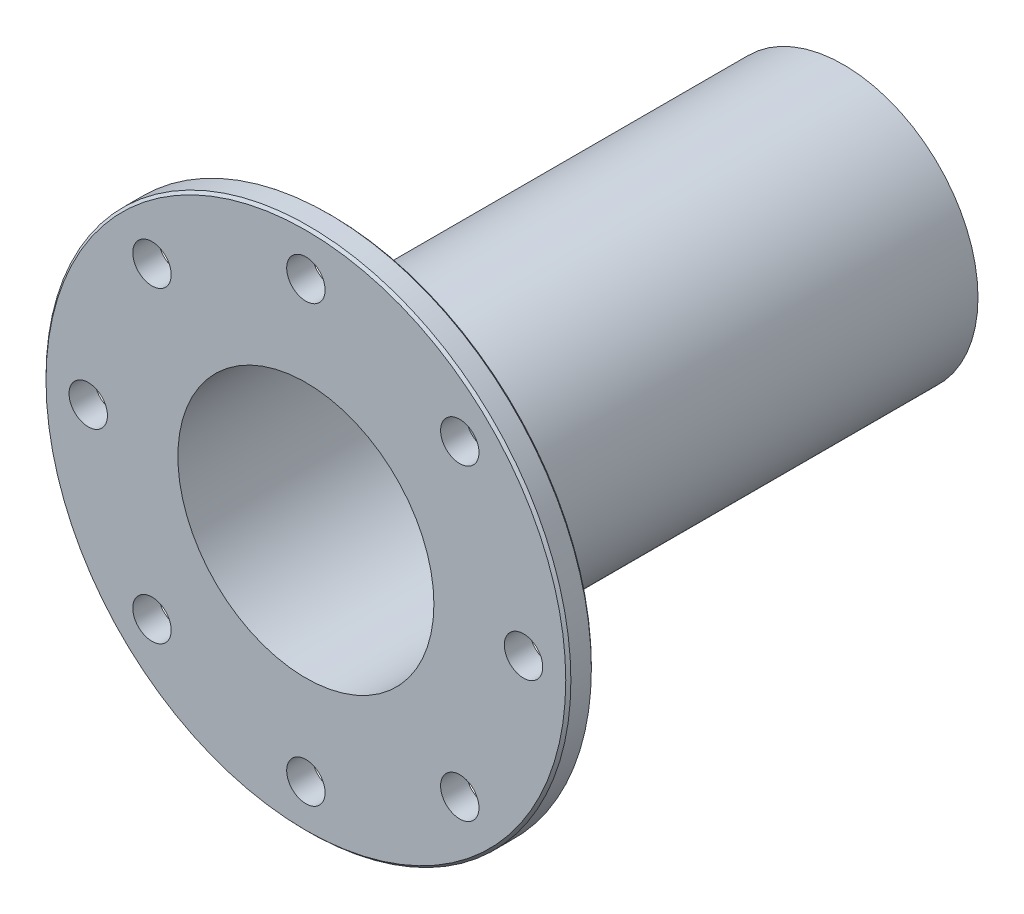
ISO-10303-21;
HEADER;
FILE_DESCRIPTION(('STEP AP214'),'2;1');
FILE_NAME('part.step','',(''),(''),'','','');
FILE_SCHEMA(('AUTOMOTIVE_DESIGN { 1 0 10303 214 1 1 1 1 }'));
ENDSEC;
DATA;
#1=APPLICATION_CONTEXT('core data for automotive mechanical design processes');
#2=APPLICATION_PROTOCOL_DEFINITION('international standard','automotive_design',2000,#1);
#3=PRODUCT_CONTEXT('',#1,'mechanical');
#4=PRODUCT('Part','Part','',(#3));
#5=PRODUCT_RELATED_PRODUCT_CATEGORY('part','',(#4));
#6=PRODUCT_DEFINITION_FORMATION('','',#4);
#7=PRODUCT_DEFINITION_CONTEXT('part definition',#1,'design');
#8=PRODUCT_DEFINITION('design','',#6,#7);
#9=PRODUCT_DEFINITION_SHAPE('','',#8);
#10=(LENGTH_UNIT() NAMED_UNIT(*) SI_UNIT(.MILLI.,.METRE.));
#11=(NAMED_UNIT(*) PLANE_ANGLE_UNIT() SI_UNIT($,.RADIAN.));
#12=(NAMED_UNIT(*) SI_UNIT($,.STERADIAN.) SOLID_ANGLE_UNIT());
#13=UNCERTAINTY_MEASURE_WITH_UNIT(LENGTH_MEASURE(1.E-05),#10,'distance_accuracy_value','');
#14=(GEOMETRIC_REPRESENTATION_CONTEXT(3) GLOBAL_UNCERTAINTY_ASSIGNED_CONTEXT((#13)) GLOBAL_UNIT_ASSIGNED_CONTEXT((#10,
#11,#12)) REPRESENTATION_CONTEXT('',''));
#15=CARTESIAN_POINT('',(0.,0.,0.));
#16=DIRECTION('',(0.,0.,1.));
#17=DIRECTION('',(1.,0.,0.));
#18=AXIS2_PLACEMENT_3D('',#15,#16,#17);
#19=CARTESIAN_POINT('',(0.,0.,0.));
#20=DIRECTION('',(0.,0.,1.));
#21=DIRECTION('',(1.,0.,0.));
#22=AXIS2_PLACEMENT_3D('',#19,#20,#21);
#23=CYLINDRICAL_SURFACE('',#22,100.);
#24=CARTESIAN_POINT('',(0.,0.,-420.));
#25=DIRECTION('',(0.,0.,1.));
#26=DIRECTION('',(1.,0.,0.));
#27=AXIS2_PLACEMENT_3D('',#24,#25,#26);
#28=CIRCLE('',#27,100.);
#29=CARTESIAN_POINT('',(100.,0.,-420.));
#30=VERTEX_POINT('',#29);
#31=EDGE_CURVE('E60',#30,#30,#28,.T.);
#32=ORIENTED_EDGE('',*,*,#31,.F.);
#33=EDGE_LOOP('',(#32));
#34=FACE_BOUND('',#33,.T.);
#35=CARTESIAN_POINT('',(0.,0.,1.04083408558608E-13));
#36=DIRECTION('',(0.,0.,1.));
#37=DIRECTION('',(1.,0.,0.));
#38=AXIS2_PLACEMENT_3D('',#35,#36,#37);
#39=CIRCLE('',#38,100.);
#40=CARTESIAN_POINT('',(100.,0.,1.04083408558608E-13));
#41=VERTEX_POINT('',#40);
#42=EDGE_CURVE('E51',#41,#41,#39,.T.);
#43=ORIENTED_EDGE('',*,*,#42,.T.);
#44=EDGE_LOOP('',(#43));
#45=FACE_BOUND('',#44,.T.);
#46=ADVANCED_FACE('F31',(#34,#45),#23,.F.);
#47=CARTESIAN_POINT('',(0.,100.,1.04083408558608E-13));
#48=DIRECTION('',(0.,0.,-1.));
#49=DIRECTION('',(-1.,0.,0.));
#50=AXIS2_PLACEMENT_3D('',#47,#48,#49);
#51=PLANE('',#50);
#52=CARTESIAN_POINT('',(0.,0.,1.04083408558608E-13));
#53=DIRECTION('',(0.,0.,-1.));
#54=DIRECTION('',(-1.,0.,0.));
#55=AXIS2_PLACEMENT_3D('',#52,#53,#54);
#56=CIRCLE('',#55,203.);
#57=CARTESIAN_POINT('',(-203.,0.,1.04083408558608E-13));
#58=VERTEX_POINT('',#57);
#59=EDGE_CURVE('E46',#58,#58,#56,.F.);
#60=ORIENTED_EDGE('',*,*,#59,.T.);
#61=EDGE_LOOP('',(#60));
#62=FACE_BOUND('',#61,.T.);
#63=CARTESIAN_POINT('',(0.,170.,0.));
#64=DIRECTION('',(0.,0.,1.));
#65=DIRECTION('',(1.,0.,0.));
#66=AXIS2_PLACEMENT_3D('',#63,#64,#65);
#67=CIRCLE('',#66,15.);
#68=CARTESIAN_POINT('',(15.,170.,0.));
#69=VERTEX_POINT('',#68);
#70=EDGE_CURVE('E104',#69,#69,#67,.T.);
#71=ORIENTED_EDGE('',*,*,#70,.F.);
#72=EDGE_LOOP('',(#71));
#73=FACE_BOUND('',#72,.T.);
#74=CARTESIAN_POINT('',(120.208152801715,120.208152801718,0.));
#75=DIRECTION('',(0.,0.,1.));
#76=DIRECTION('',(1.,0.,0.));
#77=AXIS2_PLACEMENT_3D('',#74,#75,#76);
#78=CIRCLE('',#77,15.0000000000009);
#79=CARTESIAN_POINT('',(135.208152801716,120.208152801718,0.));
#80=VERTEX_POINT('',#79);
#81=EDGE_CURVE('E98',#80,#80,#78,.T.);
#82=ORIENTED_EDGE('',*,*,#81,.F.);
#83=EDGE_LOOP('',(#82));
#84=FACE_BOUND('',#83,.T.);
#85=CARTESIAN_POINT('',(170.000000000008,7.65120558042486E-12,0.));
#86=DIRECTION('',(0.,0.,1.));
#87=DIRECTION('',(1.,0.,0.));
#88=AXIS2_PLACEMENT_3D('',#85,#86,#87);
#89=CIRCLE('',#88,15.);
#90=CARTESIAN_POINT('',(185.000000000008,7.65120558042486E-12,0.));
#91=VERTEX_POINT('',#90);
#92=EDGE_CURVE('E92',#91,#91,#89,.T.);
#93=ORIENTED_EDGE('',*,*,#92,.F.);
#94=EDGE_LOOP('',(#93));
#95=FACE_BOUND('',#94,.T.);
#96=CARTESIAN_POINT('',(120.208152801726,-120.208152801708,0.));
#97=DIRECTION('',(0.,0.,1.));
#98=DIRECTION('',(1.,0.,0.));
#99=AXIS2_PLACEMENT_3D('',#96,#97,#98);
#100=CIRCLE('',#99,15.);
#101=CARTESIAN_POINT('',(135.208152801726,-120.208152801708,0.));
#102=VERTEX_POINT('',#101);
#103=EDGE_CURVE('E86',#102,#102,#100,.T.);
#104=ORIENTED_EDGE('',*,*,#103,.F.);
#105=EDGE_LOOP('',(#104));
#106=FACE_BOUND('',#105,.T.);
#107=CARTESIAN_POINT('',(1.53024111608497E-11,-170.,0.));
#108=DIRECTION('',(0.,0.,1.));
#109=DIRECTION('',(1.,0.,0.));
#110=AXIS2_PLACEMENT_3D('',#107,#108,#109);
#111=CIRCLE('',#110,15.);
#112=CARTESIAN_POINT('',(15.0000000000153,-170.,0.));
#113=VERTEX_POINT('',#112);
#114=EDGE_CURVE('E80',#113,#113,#111,.T.);
#115=ORIENTED_EDGE('',*,*,#114,.F.);
#116=EDGE_LOOP('',(#115));
#117=FACE_BOUND('',#116,.T.);
#118=CARTESIAN_POINT('',(-120.2081528017,-120.208152801719,0.));
#119=DIRECTION('',(0.,0.,1.));
#120=DIRECTION('',(1.,0.,0.));
#121=AXIS2_PLACEMENT_3D('',#118,#119,#120);
#122=CIRCLE('',#121,15.);
#123=CARTESIAN_POINT('',(-105.2081528017,-120.208152801719,0.));
#124=VERTEX_POINT('',#123);
#125=EDGE_CURVE('E74',#124,#124,#122,.T.);
#126=ORIENTED_EDGE('',*,*,#125,.F.);
#127=EDGE_LOOP('',(#126));
#128=FACE_BOUND('',#127,.T.);
#129=CARTESIAN_POINT('',(-169.999999999992,-7.67202457601036E-12,0.));
#130=DIRECTION('',(0.,0.,1.));
#131=DIRECTION('',(1.,0.,0.));
#132=AXIS2_PLACEMENT_3D('',#129,#130,#131);
#133=CIRCLE('',#132,15.);
#134=CARTESIAN_POINT('',(-154.999999999992,-7.67202457601036E-12,0.));
#135=VERTEX_POINT('',#134);
#136=EDGE_CURVE('E67',#135,#135,#133,.T.);
#137=ORIENTED_EDGE('',*,*,#136,.F.);
#138=EDGE_LOOP('',(#137));
#139=FACE_BOUND('',#138,.T.);
#140=CARTESIAN_POINT('',(-120.208152801711,120.208152801708,0.));
#141=DIRECTION('',(0.,0.,1.));
#142=DIRECTION('',(1.,0.,0.));
#143=AXIS2_PLACEMENT_3D('',#140,#141,#142);
#144=CIRCLE('',#143,15.);
#145=CARTESIAN_POINT('',(-105.208152801711,120.208152801708,0.));
#146=VERTEX_POINT('',#145);
#147=EDGE_CURVE('E68',#146,#146,#144,.T.);
#148=ORIENTED_EDGE('',*,*,#147,.F.);
#149=EDGE_LOOP('',(#148));
#150=FACE_BOUND('',#149,.T.);
#151=ORIENTED_EDGE('',*,*,#42,.F.);
#152=EDGE_LOOP('',(#151));
#153=FACE_BOUND('',#152,.T.);
#154=ADVANCED_FACE('F114',(#62,#73,#84,#95,#106,#117,#128,#139,#150,#153),#51,.F.);
#155=CARTESIAN_POINT('',(0.,0.,0.));
#156=DIRECTION('',(0.,0.,1.));
#157=DIRECTION('',(1.,0.,0.));
#158=AXIS2_PLACEMENT_3D('',#155,#156,#157);
#159=CYLINDRICAL_SURFACE('',#158,205.);
#160=CARTESIAN_POINT('',(0.,0.,-1.99999999999998));
#161=DIRECTION('',(0.,0.,-1.));
#162=DIRECTION('',(-1.,0.,0.));
#163=AXIS2_PLACEMENT_3D('',#160,#161,#162);
#164=CIRCLE('',#163,205.);
#165=CARTESIAN_POINT('',(-205.,0.,-1.99999999999998));
#166=VERTEX_POINT('',#165);
#167=EDGE_CURVE('E38',#166,#166,#164,.T.);
#168=ORIENTED_EDGE('',*,*,#167,.T.);
#169=EDGE_LOOP('',(#168));
#170=FACE_BOUND('',#169,.T.);
#171=CARTESIAN_POINT('',(0.,0.,-17.9999999999999));
#172=DIRECTION('',(0.,0.,1.));
#173=DIRECTION('',(1.,0.,0.));
#174=AXIS2_PLACEMENT_3D('',#171,#172,#173);
#175=CIRCLE('',#174,205.);
#176=CARTESIAN_POINT('',(205.,0.,-17.9999999999999));
#177=VERTEX_POINT('',#176);
#178=EDGE_CURVE('E42',#177,#177,#175,.T.);
#179=ORIENTED_EDGE('',*,*,#178,.T.);
#180=EDGE_LOOP('',(#179));
#181=FACE_BOUND('',#180,.T.);
#182=ADVANCED_FACE('F117',(#170,#181),#159,.T.);
#183=CARTESIAN_POINT('',(0.,205.,-19.9999999999999));
#184=DIRECTION('',(0.,0.,1.));
#185=DIRECTION('',(1.,0.,0.));
#186=AXIS2_PLACEMENT_3D('',#183,#184,#185);
#187=PLANE('',#186);
#188=CARTESIAN_POINT('',(0.,0.,-19.9999999999999));
#189=DIRECTION('',(0.,0.,1.));
#190=DIRECTION('',(1.,0.,0.));
#191=AXIS2_PLACEMENT_3D('',#188,#189,#190);
#192=CIRCLE('',#191,203.);
#193=CARTESIAN_POINT('',(203.,0.,-19.9999999999999));
#194=VERTEX_POINT('',#193);
#195=EDGE_CURVE('E10',#194,#194,#192,.F.);
#196=ORIENTED_EDGE('',*,*,#195,.T.);
#197=EDGE_LOOP('',(#196));
#198=FACE_BOUND('',#197,.T.);
#199=CARTESIAN_POINT('',(0.,170.,-19.9999999999999));
#200=DIRECTION('',(0.,0.,1.));
#201=DIRECTION('',(1.,0.,0.));
#202=AXIS2_PLACEMENT_3D('',#199,#200,#201);
#203=CIRCLE('',#202,15.);
#204=CARTESIAN_POINT('',(15.,170.,-19.9999999999999));
#205=VERTEX_POINT('',#204);
#206=EDGE_CURVE('E63',#205,#205,#203,.F.);
#207=ORIENTED_EDGE('',*,*,#206,.F.);
#208=EDGE_LOOP('',(#207));
#209=FACE_BOUND('',#208,.T.);
#210=CARTESIAN_POINT('',(120.208152801715,120.208152801718,-19.9999999999999));
#211=DIRECTION('',(0.,0.,1.));
#212=DIRECTION('',(1.,0.,0.));
#213=AXIS2_PLACEMENT_3D('',#210,#211,#212);
#214=CIRCLE('',#213,15.0000000000009);
#215=CARTESIAN_POINT('',(135.208152801716,120.208152801718,-19.9999999999999));
#216=VERTEX_POINT('',#215);
#217=EDGE_CURVE('E101',#216,#216,#214,.F.);
#218=ORIENTED_EDGE('',*,*,#217,.F.);
#219=EDGE_LOOP('',(#218));
#220=FACE_BOUND('',#219,.T.);
#221=CARTESIAN_POINT('',(170.000000000008,7.65120558042486E-12,-19.9999999999999));
#222=DIRECTION('',(0.,0.,1.));
#223=DIRECTION('',(1.,0.,0.));
#224=AXIS2_PLACEMENT_3D('',#221,#222,#223);
#225=CIRCLE('',#224,15.);
#226=CARTESIAN_POINT('',(185.000000000008,7.65120558042486E-12,-19.9999999999999));
#227=VERTEX_POINT('',#226);
#228=EDGE_CURVE('E95',#227,#227,#225,.F.);
#229=ORIENTED_EDGE('',*,*,#228,.F.);
#230=EDGE_LOOP('',(#229));
#231=FACE_BOUND('',#230,.T.);
#232=CARTESIAN_POINT('',(120.208152801726,-120.208152801708,-19.9999999999999));
#233=DIRECTION('',(0.,0.,1.));
#234=DIRECTION('',(1.,0.,0.));
#235=AXIS2_PLACEMENT_3D('',#232,#233,#234);
#236=CIRCLE('',#235,15.);
#237=CARTESIAN_POINT('',(135.208152801726,-120.208152801708,-19.9999999999999));
#238=VERTEX_POINT('',#237);
#239=EDGE_CURVE('E89',#238,#238,#236,.F.);
#240=ORIENTED_EDGE('',*,*,#239,.F.);
#241=EDGE_LOOP('',(#240));
#242=FACE_BOUND('',#241,.T.);
#243=CARTESIAN_POINT('',(1.53024111608497E-11,-170.,-19.9999999999999));
#244=DIRECTION('',(0.,0.,1.));
#245=DIRECTION('',(1.,0.,0.));
#246=AXIS2_PLACEMENT_3D('',#243,#244,#245);
#247=CIRCLE('',#246,15.);
#248=CARTESIAN_POINT('',(15.0000000000153,-170.,-19.9999999999999));
#249=VERTEX_POINT('',#248);
#250=EDGE_CURVE('E83',#249,#249,#247,.F.);
#251=ORIENTED_EDGE('',*,*,#250,.F.);
#252=EDGE_LOOP('',(#251));
#253=FACE_BOUND('',#252,.T.);
#254=CARTESIAN_POINT('',(-120.2081528017,-120.208152801719,-19.9999999999999));
#255=DIRECTION('',(0.,0.,1.));
#256=DIRECTION('',(1.,0.,0.));
#257=AXIS2_PLACEMENT_3D('',#254,#255,#256);
#258=CIRCLE('',#257,15.);
#259=CARTESIAN_POINT('',(-105.2081528017,-120.208152801719,-19.9999999999999));
#260=VERTEX_POINT('',#259);
#261=EDGE_CURVE('E77',#260,#260,#258,.F.);
#262=ORIENTED_EDGE('',*,*,#261,.F.);
#263=EDGE_LOOP('',(#262));
#264=FACE_BOUND('',#263,.T.);
#265=CARTESIAN_POINT('',(-169.999999999992,-7.67202457601036E-12,-19.9999999999999));
#266=DIRECTION('',(0.,0.,1.));
#267=DIRECTION('',(1.,0.,0.));
#268=AXIS2_PLACEMENT_3D('',#265,#266,#267);
#269=CIRCLE('',#268,15.);
#270=CARTESIAN_POINT('',(-154.999999999992,-7.67202457601036E-12,-19.9999999999999));
#271=VERTEX_POINT('',#270);
#272=EDGE_CURVE('E71',#271,#271,#269,.F.);
#273=ORIENTED_EDGE('',*,*,#272,.F.);
#274=EDGE_LOOP('',(#273));
#275=FACE_BOUND('',#274,.T.);
#276=CARTESIAN_POINT('',(-120.208152801711,120.208152801708,-19.9999999999999));
#277=DIRECTION('',(0.,0.,1.));
#278=DIRECTION('',(1.,0.,0.));
#279=AXIS2_PLACEMENT_3D('',#276,#277,#278);
#280=CIRCLE('',#279,15.);
#281=CARTESIAN_POINT('',(-105.208152801711,120.208152801708,-19.9999999999999));
#282=VERTEX_POINT('',#281);
#283=EDGE_CURVE('E64',#282,#282,#280,.F.);
#284=ORIENTED_EDGE('',*,*,#283,.F.);
#285=EDGE_LOOP('',(#284));
#286=FACE_BOUND('',#285,.T.);
#287=CARTESIAN_POINT('',(0.,0.,-19.9999999999999));
#288=DIRECTION('',(0.,0.,1.));
#289=DIRECTION('',(1.,0.,0.));
#290=AXIS2_PLACEMENT_3D('',#287,#288,#289);
#291=CIRCLE('',#290,105.);
#292=CARTESIAN_POINT('',(105.,0.,-19.9999999999999));
#293=VERTEX_POINT('',#292);
#294=EDGE_CURVE('E54',#293,#293,#291,.T.);
#295=ORIENTED_EDGE('',*,*,#294,.T.);
#296=EDGE_LOOP('',(#295));
#297=FACE_BOUND('',#296,.T.);
#298=ADVANCED_FACE('F193',(#198,#209,#220,#231,#242,#253,#264,#275,#286,#297),#187,.F.);
#299=CARTESIAN_POINT('',(0.,0.,0.));
#300=DIRECTION('',(0.,0.,1.));
#301=DIRECTION('',(1.,0.,0.));
#302=AXIS2_PLACEMENT_3D('',#299,#300,#301);
#303=CYLINDRICAL_SURFACE('',#302,105.);
#304=ORIENTED_EDGE('',*,*,#294,.F.);
#305=EDGE_LOOP('',(#304));
#306=FACE_BOUND('',#305,.T.);
#307=CARTESIAN_POINT('',(0.,0.,-420.));
#308=DIRECTION('',(0.,0.,1.));
#309=DIRECTION('',(1.,0.,0.));
#310=AXIS2_PLACEMENT_3D('',#307,#308,#309);
#311=CIRCLE('',#310,105.);
#312=CARTESIAN_POINT('',(105.,0.,-420.));
#313=VERTEX_POINT('',#312);
#314=EDGE_CURVE('E57',#313,#313,#311,.T.);
#315=ORIENTED_EDGE('',*,*,#314,.T.);
#316=EDGE_LOOP('',(#315));
#317=FACE_BOUND('',#316,.T.);
#318=ADVANCED_FACE('F189',(#306,#317),#303,.T.);
#319=CARTESIAN_POINT('',(0.,105.,-420.));
#320=DIRECTION('',(0.,0.,1.));
#321=DIRECTION('',(1.,0.,0.));
#322=AXIS2_PLACEMENT_3D('',#319,#320,#321);
#323=PLANE('',#322);
#324=ORIENTED_EDGE('',*,*,#314,.F.);
#325=EDGE_LOOP('',(#324));
#326=FACE_BOUND('',#325,.T.);
#327=ORIENTED_EDGE('',*,*,#31,.T.);
#328=EDGE_LOOP('',(#327));
#329=FACE_BOUND('',#328,.T.);
#330=ADVANCED_FACE('F185',(#326,#329),#323,.F.);
#331=CARTESIAN_POINT('',(-120.208152801711,120.208152801708,-62.4264068711953));
#332=DIRECTION('',(0.,0.,1.));
#333=DIRECTION('',(1.,0.,0.));
#334=AXIS2_PLACEMENT_3D('',#331,#332,#333);
#335=CYLINDRICAL_SURFACE('',#334,15.);
#336=ORIENTED_EDGE('',*,*,#283,.T.);
#337=EDGE_LOOP('',(#336));
#338=FACE_BOUND('',#337,.T.);
#339=ORIENTED_EDGE('',*,*,#147,.T.);
#340=EDGE_LOOP('',(#339));
#341=FACE_BOUND('',#340,.T.);
#342=ADVANCED_FACE('F181',(#338,#341),#335,.F.);
#343=CARTESIAN_POINT('',(-169.999999999992,-7.67202457601036E-12,-62.4264068711953));
#344=DIRECTION('',(0.,0.,1.));
#345=DIRECTION('',(1.,0.,0.));
#346=AXIS2_PLACEMENT_3D('',#343,#344,#345);
#347=CYLINDRICAL_SURFACE('',#346,15.);
#348=ORIENTED_EDGE('',*,*,#272,.T.);
#349=EDGE_LOOP('',(#348));
#350=FACE_BOUND('',#349,.T.);
#351=ORIENTED_EDGE('',*,*,#136,.T.);
#352=EDGE_LOOP('',(#351));
#353=FACE_BOUND('',#352,.T.);
#354=ADVANCED_FACE('F177',(#350,#353),#347,.F.);
#355=CARTESIAN_POINT('',(-120.2081528017,-120.208152801719,-62.4264068711953));
#356=DIRECTION('',(0.,0.,1.));
#357=DIRECTION('',(1.,0.,0.));
#358=AXIS2_PLACEMENT_3D('',#355,#356,#357);
#359=CYLINDRICAL_SURFACE('',#358,15.);
#360=ORIENTED_EDGE('',*,*,#261,.T.);
#361=EDGE_LOOP('',(#360));
#362=FACE_BOUND('',#361,.T.);
#363=ORIENTED_EDGE('',*,*,#125,.T.);
#364=EDGE_LOOP('',(#363));
#365=FACE_BOUND('',#364,.T.);
#366=ADVANCED_FACE('F173',(#362,#365),#359,.F.);
#367=CARTESIAN_POINT('',(1.53024111608497E-11,-170.,-62.4264068711953));
#368=DIRECTION('',(0.,0.,1.));
#369=DIRECTION('',(1.,0.,0.));
#370=AXIS2_PLACEMENT_3D('',#367,#368,#369);
#371=CYLINDRICAL_SURFACE('',#370,15.);
#372=ORIENTED_EDGE('',*,*,#250,.T.);
#373=EDGE_LOOP('',(#372));
#374=FACE_BOUND('',#373,.T.);
#375=ORIENTED_EDGE('',*,*,#114,.T.);
#376=EDGE_LOOP('',(#375));
#377=FACE_BOUND('',#376,.T.);
#378=ADVANCED_FACE('F169',(#374,#377),#371,.F.);
#379=CARTESIAN_POINT('',(120.208152801726,-120.208152801708,-62.4264068711953));
#380=DIRECTION('',(0.,0.,1.));
#381=DIRECTION('',(1.,0.,0.));
#382=AXIS2_PLACEMENT_3D('',#379,#380,#381);
#383=CYLINDRICAL_SURFACE('',#382,15.);
#384=ORIENTED_EDGE('',*,*,#239,.T.);
#385=EDGE_LOOP('',(#384));
#386=FACE_BOUND('',#385,.T.);
#387=ORIENTED_EDGE('',*,*,#103,.T.);
#388=EDGE_LOOP('',(#387));
#389=FACE_BOUND('',#388,.T.);
#390=ADVANCED_FACE('F165',(#386,#389),#383,.F.);
#391=CARTESIAN_POINT('',(170.000000000008,7.65120558042486E-12,-62.4264068711953));
#392=DIRECTION('',(0.,0.,1.));
#393=DIRECTION('',(1.,0.,0.));
#394=AXIS2_PLACEMENT_3D('',#391,#392,#393);
#395=CYLINDRICAL_SURFACE('',#394,15.);
#396=ORIENTED_EDGE('',*,*,#228,.T.);
#397=EDGE_LOOP('',(#396));
#398=FACE_BOUND('',#397,.T.);
#399=ORIENTED_EDGE('',*,*,#92,.T.);
#400=EDGE_LOOP('',(#399));
#401=FACE_BOUND('',#400,.T.);
#402=ADVANCED_FACE('F159',(#398,#401),#395,.F.);
#403=CARTESIAN_POINT('',(120.208152801715,120.208152801718,-62.4264068711953));
#404=DIRECTION('',(0.,0.,1.));
#405=DIRECTION('',(1.,0.,0.));
#406=AXIS2_PLACEMENT_3D('',#403,#404,#405);
#407=CYLINDRICAL_SURFACE('',#406,15.0000000000009);
#408=ORIENTED_EDGE('',*,*,#217,.T.);
#409=EDGE_LOOP('',(#408));
#410=FACE_BOUND('',#409,.T.);
#411=ORIENTED_EDGE('',*,*,#81,.T.);
#412=EDGE_LOOP('',(#411));
#413=FACE_BOUND('',#412,.T.);
#414=ADVANCED_FACE('F151',(#410,#413),#407,.F.);
#415=CARTESIAN_POINT('',(0.,170.,-62.4264068711953));
#416=DIRECTION('',(0.,0.,1.));
#417=DIRECTION('',(1.,0.,0.));
#418=AXIS2_PLACEMENT_3D('',#415,#416,#417);
#419=CYLINDRICAL_SURFACE('',#418,15.);
#420=ORIENTED_EDGE('',*,*,#206,.T.);
#421=EDGE_LOOP('',(#420));
#422=FACE_BOUND('',#421,.T.);
#423=ORIENTED_EDGE('',*,*,#70,.T.);
#424=EDGE_LOOP('',(#423));
#425=FACE_BOUND('',#424,.T.);
#426=ADVANCED_FACE('F112',(#422,#425),#419,.F.);
#427=CARTESIAN_POINT('',(0.,0.,1.04083408558608E-13));
#428=DIRECTION('',(0.,0.,-1.));
#429=DIRECTION('',(-1.,0.,0.));
#430=AXIS2_PLACEMENT_3D('',#427,#428,#429);
#431=CONICAL_SURFACE('',#430,203.,0.785398163397455);
#432=ORIENTED_EDGE('',*,*,#167,.F.);
#433=EDGE_LOOP('',(#432));
#434=FACE_BOUND('',#433,.T.);
#435=ORIENTED_EDGE('',*,*,#59,.F.);
#436=EDGE_LOOP('',(#435));
#437=FACE_BOUND('',#436,.T.);
#438=ADVANCED_FACE('F143',(#434,#437),#431,.T.);
#439=CARTESIAN_POINT('',(0.,0.,-17.9999999999999));
#440=DIRECTION('',(0.,0.,1.));
#441=DIRECTION('',(1.,0.,0.));
#442=AXIS2_PLACEMENT_3D('',#439,#440,#441);
#443=CONICAL_SURFACE('',#442,205.,0.785398163397455);
#444=ORIENTED_EDGE('',*,*,#195,.F.);
#445=EDGE_LOOP('',(#444));
#446=FACE_BOUND('',#445,.T.);
#447=ORIENTED_EDGE('',*,*,#178,.F.);
#448=EDGE_LOOP('',(#447));
#449=FACE_BOUND('',#448,.T.);
#450=ADVANCED_FACE('F33',(#446,#449),#443,.T.);
#451=CLOSED_SHELL('',(#46,#154,#182,#298,#318,#330,#342,#354,#366,#378,#390,#402,#414,#426,#438,#450));
#452=MANIFOLD_SOLID_BREP('B2',#451);
#453=ADVANCED_BREP_SHAPE_REPRESENTATION('',(#18,#452),#14);
#454=SHAPE_DEFINITION_REPRESENTATION(#9,#453);
ENDSEC;
END-ISO-10303-21;
